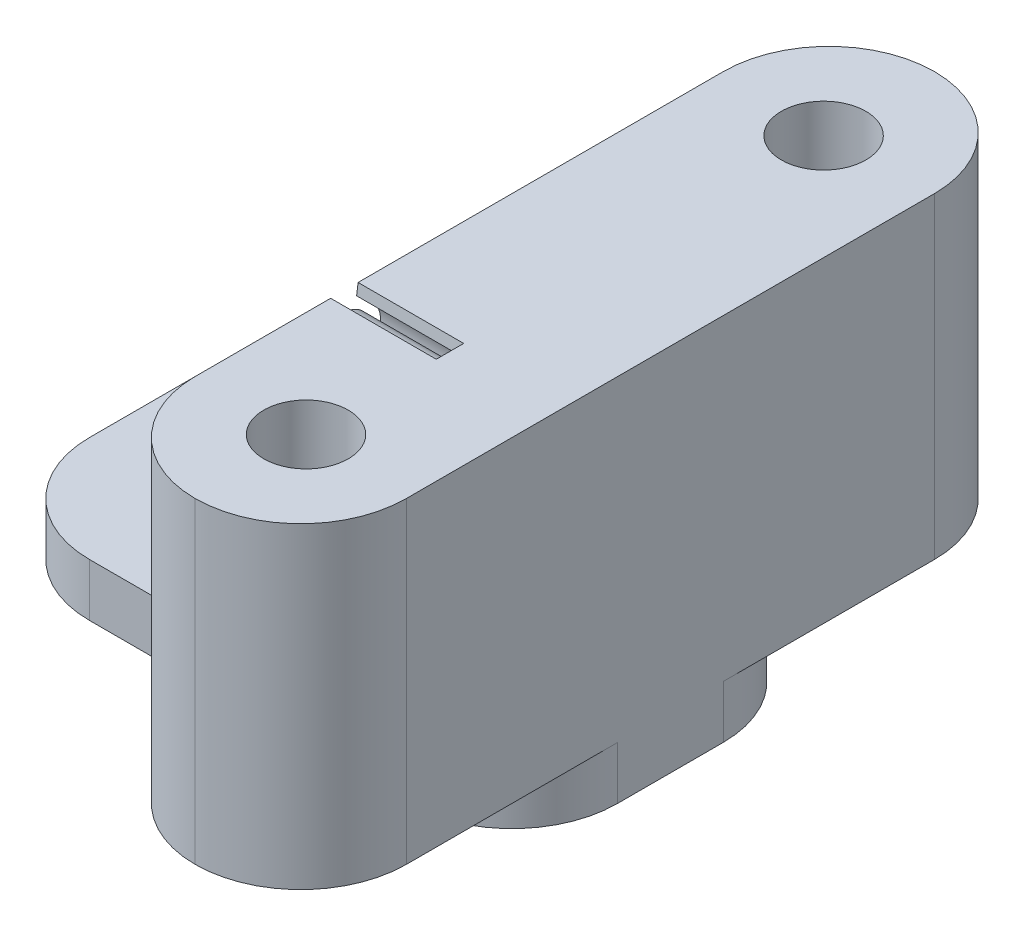
ISO-10303-21;
HEADER;
FILE_DESCRIPTION(('STEP AP214'),'2;1');
FILE_NAME('part.step','',(''),(''),'','','');
FILE_SCHEMA(('AUTOMOTIVE_DESIGN { 1 0 10303 214 1 1 1 1 }'));
ENDSEC;
DATA;
#1=APPLICATION_CONTEXT('core data for automotive mechanical design processes');
#2=APPLICATION_PROTOCOL_DEFINITION('international standard','automotive_design',2000,#1);
#3=PRODUCT_CONTEXT('',#1,'mechanical');
#4=PRODUCT('Part','Part','',(#3));
#5=PRODUCT_RELATED_PRODUCT_CATEGORY('part','',(#4));
#6=PRODUCT_DEFINITION_FORMATION('','',#4);
#7=PRODUCT_DEFINITION_CONTEXT('part definition',#1,'design');
#8=PRODUCT_DEFINITION('design','',#6,#7);
#9=PRODUCT_DEFINITION_SHAPE('','',#8);
#10=(LENGTH_UNIT() NAMED_UNIT(*) SI_UNIT(.MILLI.,.METRE.));
#11=(NAMED_UNIT(*) PLANE_ANGLE_UNIT() SI_UNIT($,.RADIAN.));
#12=(NAMED_UNIT(*) SI_UNIT($,.STERADIAN.) SOLID_ANGLE_UNIT());
#13=UNCERTAINTY_MEASURE_WITH_UNIT(LENGTH_MEASURE(1.E-05),#10,'distance_accuracy_value','');
#14=(GEOMETRIC_REPRESENTATION_CONTEXT(3) GLOBAL_UNCERTAINTY_ASSIGNED_CONTEXT((#13)) GLOBAL_UNIT_ASSIGNED_CONTEXT((#10,
#11,#12)) REPRESENTATION_CONTEXT('',''));
#15=CARTESIAN_POINT('',(0.,0.,0.));
#16=DIRECTION('',(0.,0.,1.));
#17=DIRECTION('',(1.,0.,0.));
#18=AXIS2_PLACEMENT_3D('',#15,#16,#17);
#19=CARTESIAN_POINT('',(0.,0.,0.));
#20=DIRECTION('',(0.,1.,0.));
#21=DIRECTION('',(0.,0.,1.));
#22=AXIS2_PLACEMENT_3D('',#19,#20,#21);
#23=PLANE('',#22);
#24=DIRECTION('',(-1.,0.,0.));
#25=VECTOR('',#24,1.);
#26=CARTESIAN_POINT('',(-33.5223880597015,0.,20.2388059701493));
#27=LINE('',#26,#25);
#28=CARTESIAN_POINT('',(6.47761194029853,0.,20.2388059701493));
#29=VERTEX_POINT('',#28);
#30=CARTESIAN_POINT('',(-3.52238805970146,0.,20.2388059701493));
#31=VERTEX_POINT('',#30);
#32=EDGE_CURVE('E341',#29,#31,#27,.T.);
#33=ORIENTED_EDGE('',*,*,#32,.F.);
#34=CARTESIAN_POINT('',(6.47761194029854,0.,10.2388059701493));
#35=DIRECTION('',(0.,1.,0.));
#36=DIRECTION('',(0.,0.,1.));
#37=AXIS2_PLACEMENT_3D('',#34,#35,#36);
#38=CIRCLE('',#37,10.);
#39=CARTESIAN_POINT('',(16.4776119402985,0.,10.2388059701492));
#40=VERTEX_POINT('',#39);
#41=EDGE_CURVE('E11',#29,#40,#38,.T.);
#42=ORIENTED_EDGE('',*,*,#41,.T.);
#43=DIRECTION('',(0.,0.,-1.));
#44=VECTOR('',#43,1.);
#45=CARTESIAN_POINT('',(16.4776119402985,0.,-29.7611940298508));
#46=LINE('',#45,#44);
#47=CARTESIAN_POINT('',(16.4776119402985,0.,30.2388059701493));
#48=VERTEX_POINT('',#47);
#49=EDGE_CURVE('E56',#48,#40,#46,.T.);
#50=ORIENTED_EDGE('',*,*,#49,.F.);
#51=CARTESIAN_POINT('',(6.47761194029854,0.,30.2388059701493));
#52=DIRECTION('',(0.,1.,0.));
#53=DIRECTION('',(0.,0.,1.));
#54=AXIS2_PLACEMENT_3D('',#51,#52,#53);
#55=CIRCLE('',#54,10.);
#56=CARTESIAN_POINT('',(6.47761194029854,0.,40.2388059701493));
#57=VERTEX_POINT('',#56);
#58=EDGE_CURVE('E245',#48,#57,#55,.F.);
#59=ORIENTED_EDGE('',*,*,#58,.T.);
#60=CARTESIAN_POINT('',(6.47761194029854,0.,30.2388059701493));
#61=DIRECTION('',(0.,1.,0.));
#62=DIRECTION('',(0.,0.,1.));
#63=AXIS2_PLACEMENT_3D('',#60,#61,#62);
#64=CIRCLE('',#63,10.);
#65=CARTESIAN_POINT('',(-3.52238805970146,0.,30.2388059701493));
#66=VERTEX_POINT('',#65);
#67=EDGE_CURVE('E242',#57,#66,#64,.F.);
#68=ORIENTED_EDGE('',*,*,#67,.T.);
#69=DIRECTION('',(0.,0.,1.));
#70=VECTOR('',#69,1.);
#71=CARTESIAN_POINT('',(-3.52238805970147,0.,-29.7611940298508));
#72=LINE('',#71,#70);
#73=EDGE_CURVE('E217',#31,#66,#72,.T.);
#74=ORIENTED_EDGE('',*,*,#73,.F.);
#75=EDGE_LOOP('',(#33,#42,#50,#59,#68,#74));
#76=FACE_BOUND('',#75,.T.);
#77=ADVANCED_FACE('F33',(#76),#23,.F.);
#78=DIRECTION('',(1.,0.,0.));
#79=VECTOR('',#78,1.);
#80=CARTESIAN_POINT('',(-33.5223880597015,0.,-9.76119402985075));
#81=LINE('',#80,#79);
#82=CARTESIAN_POINT('',(-3.52238805970147,0.,-9.76119402985075));
#83=VERTEX_POINT('',#82);
#84=CARTESIAN_POINT('',(6.47761194029853,0.,-9.76119402985075));
#85=VERTEX_POINT('',#84);
#86=EDGE_CURVE('E263',#83,#85,#81,.T.);
#87=ORIENTED_EDGE('',*,*,#86,.F.);
#88=CARTESIAN_POINT('',(-3.52238805970147,0.,-19.7611940298507));
#89=VERTEX_POINT('',#88);
#90=EDGE_CURVE('E233',#89,#83,#72,.T.);
#91=ORIENTED_EDGE('',*,*,#90,.F.);
#92=CARTESIAN_POINT('',(6.47761194029853,0.,-19.7611940298507));
#93=DIRECTION('',(0.,1.,0.));
#94=DIRECTION('',(0.,0.,1.));
#95=AXIS2_PLACEMENT_3D('',#92,#93,#94);
#96=CIRCLE('',#95,10.);
#97=CARTESIAN_POINT('',(6.47761194029853,0.,-29.7611940298508));
#98=VERTEX_POINT('',#97);
#99=EDGE_CURVE('E249',#89,#98,#96,.F.);
#100=ORIENTED_EDGE('',*,*,#99,.T.);
#101=CARTESIAN_POINT('',(6.47761194029853,0.,-19.7611940298507));
#102=DIRECTION('',(0.,1.,0.));
#103=DIRECTION('',(0.,0.,1.));
#104=AXIS2_PLACEMENT_3D('',#101,#102,#103);
#105=CIRCLE('',#104,10.);
#106=CARTESIAN_POINT('',(16.4776119402985,0.,-19.7611940298507));
#107=VERTEX_POINT('',#106);
#108=EDGE_CURVE('E247',#98,#107,#105,.F.);
#109=ORIENTED_EDGE('',*,*,#108,.T.);
#110=CARTESIAN_POINT('',(16.4776119402985,0.,0.238805970149251));
#111=VERTEX_POINT('',#110);
#112=EDGE_CURVE('E48',#111,#107,#46,.T.);
#113=ORIENTED_EDGE('',*,*,#112,.F.);
#114=CARTESIAN_POINT('',(6.47761194029854,0.,0.238805970149251));
#115=DIRECTION('',(0.,1.,0.));
#116=DIRECTION('',(0.,0.,1.));
#117=AXIS2_PLACEMENT_3D('',#114,#115,#116);
#118=CIRCLE('',#117,10.);
#119=EDGE_CURVE('E41',#111,#85,#118,.T.);
#120=ORIENTED_EDGE('',*,*,#119,.T.);
#121=EDGE_LOOP('',(#87,#91,#100,#109,#113,#120));
#122=FACE_BOUND('',#121,.T.);
#123=ADVANCED_FACE('F308',(#122),#23,.F.);
#124=CARTESIAN_POINT('',(-3.52238805970147,30.,-29.7611940298508));
#125=DIRECTION('',(1.,0.,0.));
#126=DIRECTION('',(0.,0.,-1.));
#127=AXIS2_PLACEMENT_3D('',#124,#125,#126);
#128=PLANE('',#127);
#129=DIRECTION('',(0.,0.,1.));
#130=VECTOR('',#129,1.);
#131=CARTESIAN_POINT('',(-3.52238805970147,30.,-29.7611940298508));
#132=LINE('',#131,#130);
#133=CARTESIAN_POINT('',(-3.52238805970147,30.,-19.7611940298507));
#134=VERTEX_POINT('',#133);
#135=CARTESIAN_POINT('',(-3.52238805970146,30.,14.812554190196));
#136=VERTEX_POINT('',#135);
#137=EDGE_CURVE('E226',#134,#136,#132,.T.);
#138=ORIENTED_EDGE('',*,*,#137,.F.);
#139=DIRECTION('',(0.,-1.,0.));
#140=VECTOR('',#139,1.);
#141=CARTESIAN_POINT('',(-3.52238805970147,30.,-19.7611940298507));
#142=LINE('',#141,#140);
#143=EDGE_CURVE('E239',#134,#89,#142,.T.);
#144=ORIENTED_EDGE('',*,*,#143,.T.);
#145=ORIENTED_EDGE('',*,*,#90,.T.);
#146=EDGE_CURVE('E236',#83,#31,#72,.T.);
#147=ORIENTED_EDGE('',*,*,#146,.T.);
#148=ORIENTED_EDGE('',*,*,#73,.T.);
#149=DIRECTION('',(0.,-1.,0.));
#150=VECTOR('',#149,1.);
#151=CARTESIAN_POINT('',(-3.52238805970146,30.,30.2388059701493));
#152=LINE('',#151,#150);
#153=CARTESIAN_POINT('',(-3.52238805970146,30.,30.2388059701493));
#154=VERTEX_POINT('',#153);
#155=EDGE_CURVE('E232',#66,#154,#152,.F.);
#156=ORIENTED_EDGE('',*,*,#155,.T.);
#157=CARTESIAN_POINT('',(-3.52238805970146,30.,17.4075983617578));
#158=VERTEX_POINT('',#157);
#159=EDGE_CURVE('E229',#158,#154,#132,.T.);
#160=ORIENTED_EDGE('',*,*,#159,.F.);
#161=DIRECTION('',(0.,-0.998274373174996,-0.0587220219514735));
#162=VECTOR('',#161,1.);
#163=CARTESIAN_POINT('',(-3.52238805970146,-0.916997145344465,15.5889514708551));
#164=LINE('',#163,#162);
#165=CARTESIAN_POINT('',(-3.52238805970146,28.9802150072761,17.3476110092446));
#166=VERTEX_POINT('',#165);
#167=EDGE_CURVE('E202',#158,#166,#164,.T.);
#168=ORIENTED_EDGE('',*,*,#167,.T.);
#169=CARTESIAN_POINT('',(-3.52238805970146,25.6865831727299,16.1635547021105));
#170=DIRECTION('',(-1.,0.,0.));
#171=DIRECTION('',(0.,0.,1.));
#172=AXIS2_PLACEMENT_3D('',#169,#170,#171);
#173=CIRCLE('',#172,3.5);
#174=CARTESIAN_POINT('',(-3.52238805970146,28.9694464253818,14.9499613334784));
#175=VERTEX_POINT('',#174);
#176=EDGE_CURVE('E199',#175,#166,#173,.T.);
#177=ORIENTED_EDGE('',*,*,#176,.F.);
#178=DIRECTION('',(0.,0.991227900682634,-0.132163720091024));
#179=VECTOR('',#178,1.);
#180=CARTESIAN_POINT('',(-3.52238805970146,2.46452674980748,18.4839506235552));
#181=LINE('',#180,#179);
#182=EDGE_CURVE('E170',#175,#136,#181,.T.);
#183=ORIENTED_EDGE('',*,*,#182,.T.);
#184=EDGE_LOOP('',(#138,#144,#145,#147,#148,#156,#160,#168,#177,#183));
#185=FACE_BOUND('',#184,.T.);
#186=ADVANCED_FACE('F369',(#185),#128,.F.);
#187=CARTESIAN_POINT('',(0.,30.,0.));
#188=DIRECTION('',(0.,1.,0.));
#189=DIRECTION('',(0.,0.,1.));
#190=AXIS2_PLACEMENT_3D('',#187,#188,#189);
#191=PLANE('',#190);
#192=CARTESIAN_POINT('',(6.47761194029853,30.,-19.2611940298507));
#193=DIRECTION('',(0.,1.,0.));
#194=DIRECTION('',(0.,0.,1.));
#195=AXIS2_PLACEMENT_3D('',#192,#193,#194);
#196=CIRCLE('',#195,4.);
#197=CARTESIAN_POINT('',(6.47761194029853,30.,-15.2611940298507));
#198=VERTEX_POINT('',#197);
#199=EDGE_CURVE('E218',#198,#198,#196,.T.);
#200=ORIENTED_EDGE('',*,*,#199,.F.);
#201=EDGE_LOOP('',(#200));
#202=FACE_BOUND('',#201,.T.);
#203=CARTESIAN_POINT('',(6.47761194029853,30.,29.7388059701493));
#204=DIRECTION('',(0.,1.,0.));
#205=DIRECTION('',(0.,0.,1.));
#206=AXIS2_PLACEMENT_3D('',#203,#204,#205);
#207=CIRCLE('',#206,4.);
#208=CARTESIAN_POINT('',(6.47761194029853,30.,33.7388059701493));
#209=VERTEX_POINT('',#208);
#210=EDGE_CURVE('E209',#209,#209,#207,.T.);
#211=ORIENTED_EDGE('',*,*,#210,.F.);
#212=EDGE_LOOP('',(#211));
#213=FACE_BOUND('',#212,.T.);
#214=CARTESIAN_POINT('',(6.47761194029853,30.,-19.7611940298507));
#215=DIRECTION('',(0.,1.,0.));
#216=DIRECTION('',(0.,0.,1.));
#217=AXIS2_PLACEMENT_3D('',#214,#215,#216);
#218=CIRCLE('',#217,10.);
#219=CARTESIAN_POINT('',(16.4776119402985,30.,-19.7611940298507));
#220=VERTEX_POINT('',#219);
#221=CARTESIAN_POINT('',(6.47761194029853,30.,-29.7611940298508));
#222=VERTEX_POINT('',#221);
#223=EDGE_CURVE('E255',#220,#222,#218,.T.);
#224=ORIENTED_EDGE('',*,*,#223,.T.);
#225=CARTESIAN_POINT('',(6.47761194029853,30.,-19.7611940298507));
#226=DIRECTION('',(0.,1.,0.));
#227=DIRECTION('',(0.,0.,1.));
#228=AXIS2_PLACEMENT_3D('',#225,#226,#227);
#229=CIRCLE('',#228,10.);
#230=EDGE_CURVE('E257',#222,#134,#229,.T.);
#231=ORIENTED_EDGE('',*,*,#230,.T.);
#232=ORIENTED_EDGE('',*,*,#137,.T.);
#233=DIRECTION('',(-1.,0.,0.));
#234=VECTOR('',#233,1.);
#235=CARTESIAN_POINT('',(6.47761194029853,30.,14.812554190196));
#236=LINE('',#235,#234);
#237=CARTESIAN_POINT('',(6.47761194029853,30.,14.812554190196));
#238=VERTEX_POINT('',#237);
#239=EDGE_CURVE('E207',#238,#136,#236,.T.);
#240=ORIENTED_EDGE('',*,*,#239,.F.);
#241=DIRECTION('',(0.,0.,-1.));
#242=VECTOR('',#241,1.);
#243=CARTESIAN_POINT('',(6.47761194029853,30.,0.));
#244=LINE('',#243,#242);
#245=CARTESIAN_POINT('',(6.47761194029853,30.,17.4075983617578));
#246=VERTEX_POINT('',#245);
#247=EDGE_CURVE('E184',#246,#238,#244,.T.);
#248=ORIENTED_EDGE('',*,*,#247,.F.);
#249=DIRECTION('',(-1.,0.,0.));
#250=VECTOR('',#249,1.);
#251=CARTESIAN_POINT('',(6.47761194029853,30.,17.4075983617578));
#252=LINE('',#251,#250);
#253=EDGE_CURVE('E210',#246,#158,#252,.T.);
#254=ORIENTED_EDGE('',*,*,#253,.T.);
#255=ORIENTED_EDGE('',*,*,#159,.T.);
#256=CARTESIAN_POINT('',(6.47761194029854,30.,30.2388059701493));
#257=DIRECTION('',(0.,1.,0.));
#258=DIRECTION('',(0.,0.,1.));
#259=AXIS2_PLACEMENT_3D('',#256,#257,#258);
#260=CIRCLE('',#259,10.);
#261=CARTESIAN_POINT('',(6.47761194029854,30.,40.2388059701493));
#262=VERTEX_POINT('',#261);
#263=EDGE_CURVE('E251',#154,#262,#260,.T.);
#264=ORIENTED_EDGE('',*,*,#263,.T.);
#265=CARTESIAN_POINT('',(6.47761194029854,30.,30.2388059701493));
#266=DIRECTION('',(0.,1.,0.));
#267=DIRECTION('',(0.,0.,1.));
#268=AXIS2_PLACEMENT_3D('',#265,#266,#267);
#269=CIRCLE('',#268,10.);
#270=CARTESIAN_POINT('',(16.4776119402985,30.,30.2388059701493));
#271=VERTEX_POINT('',#270);
#272=EDGE_CURVE('E253',#262,#271,#269,.T.);
#273=ORIENTED_EDGE('',*,*,#272,.T.);
#274=DIRECTION('',(0.,0.,-1.));
#275=VECTOR('',#274,1.);
#276=CARTESIAN_POINT('',(16.4776119402985,30.,-29.7611940298508));
#277=LINE('',#276,#275);
#278=EDGE_CURVE('E228',#271,#220,#277,.T.);
#279=ORIENTED_EDGE('',*,*,#278,.T.);
#280=EDGE_LOOP('',(#224,#231,#232,#240,#248,#254,#255,#264,#273,#279));
#281=FACE_BOUND('',#280,.T.);
#282=ADVANCED_FACE('F381',(#202,#213,#281),#191,.T.);
#283=CARTESIAN_POINT('',(16.4776119402985,30.,-29.7611940298508));
#284=DIRECTION('',(-1.,0.,0.));
#285=DIRECTION('',(0.,0.,1.));
#286=AXIS2_PLACEMENT_3D('',#283,#284,#285);
#287=PLANE('',#286);
#288=DIRECTION('',(0.,0.,1.));
#289=VECTOR('',#288,1.);
#290=CARTESIAN_POINT('',(16.4776119402985,-5.,20.2388059701493));
#291=LINE('',#290,#289);
#292=CARTESIAN_POINT('',(16.4776119402985,-5.,0.238805970149251));
#293=VERTEX_POINT('',#292);
#294=CARTESIAN_POINT('',(16.4776119402985,-5.,10.2388059701492));
#295=VERTEX_POINT('',#294);
#296=EDGE_CURVE('E327',#293,#295,#291,.T.);
#297=ORIENTED_EDGE('',*,*,#296,.F.);
#298=DIRECTION('',(0.,1.,0.));
#299=VECTOR('',#298,1.);
#300=CARTESIAN_POINT('',(16.4776119402985,30.,0.238805970149251));
#301=LINE('',#300,#299);
#302=EDGE_CURVE('E304',#293,#111,#301,.T.);
#303=ORIENTED_EDGE('',*,*,#302,.T.);
#304=ORIENTED_EDGE('',*,*,#112,.T.);
#305=DIRECTION('',(0.,-1.,0.));
#306=VECTOR('',#305,1.);
#307=CARTESIAN_POINT('',(16.4776119402985,30.,-19.7611940298507));
#308=LINE('',#307,#306);
#309=EDGE_CURVE('E261',#107,#220,#308,.F.);
#310=ORIENTED_EDGE('',*,*,#309,.T.);
#311=ORIENTED_EDGE('',*,*,#278,.F.);
#312=DIRECTION('',(0.,-1.,0.));
#313=VECTOR('',#312,1.);
#314=CARTESIAN_POINT('',(16.4776119402985,30.,30.2388059701493));
#315=LINE('',#314,#313);
#316=EDGE_CURVE('E259',#271,#48,#315,.T.);
#317=ORIENTED_EDGE('',*,*,#316,.T.);
#318=ORIENTED_EDGE('',*,*,#49,.T.);
#319=DIRECTION('',(0.,1.,0.));
#320=VECTOR('',#319,1.);
#321=CARTESIAN_POINT('',(16.4776119402985,30.,10.2388059701492));
#322=LINE('',#321,#320);
#323=EDGE_CURVE('E302',#40,#295,#322,.F.);
#324=ORIENTED_EDGE('',*,*,#323,.T.);
#325=EDGE_LOOP('',(#297,#303,#304,#310,#311,#317,#318,#324));
#326=FACE_BOUND('',#325,.T.);
#327=ADVANCED_FACE('F330',(#326),#287,.F.);
#328=CARTESIAN_POINT('',(6.47761194029853,10.,29.7388059701493));
#329=DIRECTION('',(0.,1.,0.));
#330=DIRECTION('',(0.,0.,1.));
#331=AXIS2_PLACEMENT_3D('',#328,#329,#330);
#332=CYLINDRICAL_SURFACE('',#331,4.);
#333=CARTESIAN_POINT('',(6.47761194029853,10.,29.7388059701493));
#334=DIRECTION('',(0.,1.,0.));
#335=DIRECTION('',(0.,0.,1.));
#336=AXIS2_PLACEMENT_3D('',#333,#334,#335);
#337=CIRCLE('',#336,4.);
#338=CARTESIAN_POINT('',(6.47761194029853,10.,33.7388059701493));
#339=VERTEX_POINT('',#338);
#340=EDGE_CURVE('E221',#339,#339,#337,.T.);
#341=ORIENTED_EDGE('',*,*,#340,.F.);
#342=EDGE_LOOP('',(#341));
#343=FACE_BOUND('',#342,.T.);
#344=ORIENTED_EDGE('',*,*,#210,.T.);
#345=EDGE_LOOP('',(#344));
#346=FACE_BOUND('',#345,.T.);
#347=ADVANCED_FACE('F418',(#343,#346),#332,.F.);
#348=CARTESIAN_POINT('',(6.47761194029853,10.,29.7388059701493));
#349=DIRECTION('',(0.,1.,0.));
#350=DIRECTION('',(0.,0.,1.));
#351=AXIS2_PLACEMENT_3D('',#348,#349,#350);
#352=PLANE('',#351);
#353=ORIENTED_EDGE('',*,*,#340,.T.);
#354=EDGE_LOOP('',(#353));
#355=FACE_BOUND('',#354,.T.);
#356=ADVANCED_FACE('F454',(#355),#352,.T.);
#357=CARTESIAN_POINT('',(6.47761194029853,10.,-19.2611940298507));
#358=DIRECTION('',(0.,1.,0.));
#359=DIRECTION('',(0.,0.,1.));
#360=AXIS2_PLACEMENT_3D('',#357,#358,#359);
#361=CYLINDRICAL_SURFACE('',#360,4.);
#362=CARTESIAN_POINT('',(6.47761194029853,10.,-19.2611940298507));
#363=DIRECTION('',(0.,1.,0.));
#364=DIRECTION('',(0.,0.,1.));
#365=AXIS2_PLACEMENT_3D('',#362,#363,#364);
#366=CIRCLE('',#365,4.);
#367=CARTESIAN_POINT('',(6.47761194029853,10.,-15.2611940298507));
#368=VERTEX_POINT('',#367);
#369=EDGE_CURVE('E214',#368,#368,#366,.T.);
#370=ORIENTED_EDGE('',*,*,#369,.F.);
#371=EDGE_LOOP('',(#370));
#372=FACE_BOUND('',#371,.T.);
#373=ORIENTED_EDGE('',*,*,#199,.T.);
#374=EDGE_LOOP('',(#373));
#375=FACE_BOUND('',#374,.T.);
#376=ADVANCED_FACE('F450',(#372,#375),#361,.F.);
#377=CARTESIAN_POINT('',(6.47761194029853,10.,-19.2611940298507));
#378=DIRECTION('',(0.,1.,0.));
#379=DIRECTION('',(0.,0.,1.));
#380=AXIS2_PLACEMENT_3D('',#377,#378,#379);
#381=PLANE('',#380);
#382=ORIENTED_EDGE('',*,*,#369,.T.);
#383=EDGE_LOOP('',(#382));
#384=FACE_BOUND('',#383,.T.);
#385=ADVANCED_FACE('F447',(#384),#381,.T.);
#386=CARTESIAN_POINT('',(6.47761194029853,2.46452674980748,18.4839506235552));
#387=DIRECTION('',(0.,0.132163720091024,0.991227900682634));
#388=DIRECTION('',(0.,-0.991227900682634,0.132163720091024));
#389=AXIS2_PLACEMENT_3D('',#386,#387,#388);
#390=PLANE('',#389);
#391=ORIENTED_EDGE('',*,*,#182,.F.);
#392=DIRECTION('',(-1.,0.,0.));
#393=VECTOR('',#392,1.);
#394=CARTESIAN_POINT('',(6.47761194029853,28.9694464253818,14.9499613334784));
#395=LINE('',#394,#393);
#396=CARTESIAN_POINT('',(6.47761194029853,28.9694464253818,14.9499613334784));
#397=VERTEX_POINT('',#396);
#398=EDGE_CURVE('E163',#397,#175,#395,.T.);
#399=ORIENTED_EDGE('',*,*,#398,.F.);
#400=DIRECTION('',(0.,0.991227900682634,-0.132163720091024));
#401=VECTOR('',#400,1.);
#402=CARTESIAN_POINT('',(6.47761194029853,2.46452674980748,18.4839506235552));
#403=LINE('',#402,#401);
#404=EDGE_CURVE('E167',#397,#238,#403,.T.);
#405=ORIENTED_EDGE('',*,*,#404,.T.);
#406=ORIENTED_EDGE('',*,*,#239,.T.);
#407=EDGE_LOOP('',(#391,#399,#405,#406));
#408=FACE_BOUND('',#407,.T.);
#409=ADVANCED_FACE('F165',(#408),#390,.T.);
#410=CARTESIAN_POINT('',(6.47761194029853,-0.916997145344465,15.5889514708551));
#411=DIRECTION('',(0.,0.0587220219514735,-0.998274373174996));
#412=DIRECTION('',(0.,0.998274373174996,0.0587220219514735));
#413=AXIS2_PLACEMENT_3D('',#410,#411,#412);
#414=PLANE('',#413);
#415=ORIENTED_EDGE('',*,*,#167,.F.);
#416=ORIENTED_EDGE('',*,*,#253,.F.);
#417=DIRECTION('',(0.,-0.998274373174996,-0.0587220219514735));
#418=VECTOR('',#417,1.);
#419=CARTESIAN_POINT('',(6.47761194029853,-0.916997145344465,15.5889514708551));
#420=LINE('',#419,#418);
#421=CARTESIAN_POINT('',(6.47761194029853,28.9802150072761,17.3476110092446));
#422=VERTEX_POINT('',#421);
#423=EDGE_CURVE('E190',#246,#422,#420,.T.);
#424=ORIENTED_EDGE('',*,*,#423,.T.);
#425=DIRECTION('',(-1.,0.,0.));
#426=VECTOR('',#425,1.);
#427=CARTESIAN_POINT('',(6.47761194029853,28.9802150072761,17.3476110092446));
#428=LINE('',#427,#426);
#429=EDGE_CURVE('E175',#422,#166,#428,.T.);
#430=ORIENTED_EDGE('',*,*,#429,.T.);
#431=EDGE_LOOP('',(#415,#416,#424,#430));
#432=FACE_BOUND('',#431,.T.);
#433=ADVANCED_FACE('F385',(#432),#414,.T.);
#434=CARTESIAN_POINT('',(6.47761194029853,25.6865831727299,16.1635547021105));
#435=DIRECTION('',(-1.,0.,0.));
#436=DIRECTION('',(0.,0.,1.));
#437=AXIS2_PLACEMENT_3D('',#434,#435,#436);
#438=CYLINDRICAL_SURFACE('',#437,3.5);
#439=ORIENTED_EDGE('',*,*,#176,.T.);
#440=ORIENTED_EDGE('',*,*,#429,.F.);
#441=CARTESIAN_POINT('',(6.47761194029853,25.6865831727299,16.1635547021105));
#442=DIRECTION('',(-1.,0.,0.));
#443=DIRECTION('',(0.,0.,1.));
#444=AXIS2_PLACEMENT_3D('',#441,#442,#443);
#445=CIRCLE('',#444,3.5);
#446=EDGE_CURVE('E182',#397,#422,#445,.T.);
#447=ORIENTED_EDGE('',*,*,#446,.F.);
#448=ORIENTED_EDGE('',*,*,#398,.T.);
#449=EDGE_LOOP('',(#439,#440,#447,#448));
#450=FACE_BOUND('',#449,.T.);
#451=ADVANCED_FACE('F189',(#450),#438,.F.);
#452=CARTESIAN_POINT('',(6.47761194029853,25.6865831727299,16.1635547021105));
#453=DIRECTION('',(-1.,0.,0.));
#454=DIRECTION('',(0.,0.,1.));
#455=AXIS2_PLACEMENT_3D('',#452,#453,#454);
#456=CYLINDRICAL_SURFACE('',#455,2.5);
#457=CARTESIAN_POINT('',(6.47761194029853,25.6865831727299,16.1635547021105));
#458=DIRECTION('',(-1.,0.,0.));
#459=DIRECTION('',(0.,0.,1.));
#460=AXIS2_PLACEMENT_3D('',#457,#458,#459);
#461=CIRCLE('',#460,2.5);
#462=CARTESIAN_POINT('',(6.47761194029853,25.6865831727299,18.6635547021105));
#463=VERTEX_POINT('',#462);
#464=EDGE_CURVE('E176',#463,#463,#461,.T.);
#465=ORIENTED_EDGE('',*,*,#464,.T.);
#466=EDGE_LOOP('',(#465));
#467=FACE_BOUND('',#466,.T.);
#468=CARTESIAN_POINT('',(-3.52238805970146,25.6865831727299,16.1635547021105));
#469=DIRECTION('',(-1.,0.,0.));
#470=DIRECTION('',(0.,0.,1.));
#471=AXIS2_PLACEMENT_3D('',#468,#469,#470);
#472=CIRCLE('',#471,2.5);
#473=CARTESIAN_POINT('',(-3.52238805970146,25.6865831727299,18.6635547021105));
#474=VERTEX_POINT('',#473);
#475=EDGE_CURVE('E186',#474,#474,#472,.T.);
#476=ORIENTED_EDGE('',*,*,#475,.F.);
#477=EDGE_LOOP('',(#476));
#478=FACE_BOUND('',#477,.T.);
#479=ADVANCED_FACE('F431',(#467,#478),#456,.T.);
#480=CARTESIAN_POINT('',(6.47761194029853,0.,0.));
#481=DIRECTION('',(-1.,0.,0.));
#482=DIRECTION('',(0.,0.,1.));
#483=AXIS2_PLACEMENT_3D('',#480,#481,#482);
#484=PLANE('',#483);
#485=ORIENTED_EDGE('',*,*,#404,.F.);
#486=ORIENTED_EDGE('',*,*,#446,.T.);
#487=ORIENTED_EDGE('',*,*,#423,.F.);
#488=ORIENTED_EDGE('',*,*,#247,.T.);
#489=EDGE_LOOP('',(#485,#486,#487,#488));
#490=FACE_BOUND('',#489,.T.);
#491=ORIENTED_EDGE('',*,*,#464,.F.);
#492=EDGE_LOOP('',(#491));
#493=FACE_BOUND('',#492,.T.);
#494=ADVANCED_FACE('F180',(#490,#493),#484,.T.);
#495=ORIENTED_EDGE('',*,*,#475,.T.);
#496=EDGE_LOOP('',(#495));
#497=FACE_BOUND('',#496,.T.);
#498=ADVANCED_FACE('F421',(#497),#128,.F.);
#499=CARTESIAN_POINT('',(6.47761194029853,30.,-19.7611940298507));
#500=DIRECTION('',(0.,-1.,0.));
#501=DIRECTION('',(0.,0.,-1.));
#502=AXIS2_PLACEMENT_3D('',#499,#500,#501);
#503=CYLINDRICAL_SURFACE('',#502,10.);
#504=DIRECTION('',(0.,-1.,0.));
#505=VECTOR('',#504,1.);
#506=CARTESIAN_POINT('',(6.47761194029853,30.,-29.7611940298508));
#507=LINE('',#506,#505);
#508=EDGE_CURVE('E200',#222,#98,#507,.T.);
#509=ORIENTED_EDGE('',*,*,#508,.F.);
#510=ORIENTED_EDGE('',*,*,#223,.F.);
#511=ORIENTED_EDGE('',*,*,#309,.F.);
#512=ORIENTED_EDGE('',*,*,#108,.F.);
#513=EDGE_LOOP('',(#509,#510,#511,#512));
#514=FACE_BOUND('',#513,.T.);
#515=ADVANCED_FACE('F394',(#514),#503,.T.);
#516=CARTESIAN_POINT('',(6.47761194029853,30.,-19.7611940298507));
#517=DIRECTION('',(0.,-1.,0.));
#518=DIRECTION('',(0.,0.,-1.));
#519=AXIS2_PLACEMENT_3D('',#516,#517,#518);
#520=CYLINDRICAL_SURFACE('',#519,10.);
#521=ORIENTED_EDGE('',*,*,#230,.F.);
#522=ORIENTED_EDGE('',*,*,#508,.T.);
#523=ORIENTED_EDGE('',*,*,#99,.F.);
#524=ORIENTED_EDGE('',*,*,#143,.F.);
#525=EDGE_LOOP('',(#521,#522,#523,#524));
#526=FACE_BOUND('',#525,.T.);
#527=ADVANCED_FACE('F389',(#526),#520,.T.);
#528=CARTESIAN_POINT('',(6.47761194029854,30.,30.2388059701493));
#529=DIRECTION('',(0.,-1.,0.));
#530=DIRECTION('',(0.,0.,-1.));
#531=AXIS2_PLACEMENT_3D('',#528,#529,#530);
#532=CYLINDRICAL_SURFACE('',#531,10.);
#533=DIRECTION('',(0.,-1.,0.));
#534=VECTOR('',#533,1.);
#535=CARTESIAN_POINT('',(6.47761194029854,30.,40.2388059701493));
#536=LINE('',#535,#534);
#537=EDGE_CURVE('E266',#262,#57,#536,.T.);
#538=ORIENTED_EDGE('',*,*,#537,.F.);
#539=ORIENTED_EDGE('',*,*,#263,.F.);
#540=ORIENTED_EDGE('',*,*,#155,.F.);
#541=ORIENTED_EDGE('',*,*,#67,.F.);
#542=EDGE_LOOP('',(#538,#539,#540,#541));
#543=FACE_BOUND('',#542,.T.);
#544=ADVANCED_FACE('F378',(#543),#532,.T.);
#545=CARTESIAN_POINT('',(6.47761194029854,30.,30.2388059701493));
#546=DIRECTION('',(0.,-1.,0.));
#547=DIRECTION('',(0.,0.,-1.));
#548=AXIS2_PLACEMENT_3D('',#545,#546,#547);
#549=CYLINDRICAL_SURFACE('',#548,10.);
#550=ORIENTED_EDGE('',*,*,#272,.F.);
#551=ORIENTED_EDGE('',*,*,#537,.T.);
#552=ORIENTED_EDGE('',*,*,#58,.F.);
#553=ORIENTED_EDGE('',*,*,#316,.F.);
#554=EDGE_LOOP('',(#550,#551,#552,#553));
#555=FACE_BOUND('',#554,.T.);
#556=ADVANCED_FACE('F398',(#555),#549,.T.);
#557=CARTESIAN_POINT('',(-33.5223880597015,-5.,20.2388059701493));
#558=DIRECTION('',(1.,0.,0.));
#559=DIRECTION('',(0.,0.,-1.));
#560=AXIS2_PLACEMENT_3D('',#557,#558,#559);
#561=PLANE('',#560);
#562=DIRECTION('',(0.,0.,-1.));
#563=VECTOR('',#562,1.);
#564=CARTESIAN_POINT('',(-33.5223880597015,0.,20.2388059701493));
#565=LINE('',#564,#563);
#566=CARTESIAN_POINT('',(-33.5223880597015,0.,10.2388059701493));
#567=VERTEX_POINT('',#566);
#568=CARTESIAN_POINT('',(-33.5223880597015,0.,0.238805970149251));
#569=VERTEX_POINT('',#568);
#570=EDGE_CURVE('E273',#567,#569,#565,.T.);
#571=ORIENTED_EDGE('',*,*,#570,.T.);
#572=DIRECTION('',(0.,1.,0.));
#573=VECTOR('',#572,1.);
#574=CARTESIAN_POINT('',(-33.5223880597015,-5.,0.238805970149251));
#575=LINE('',#574,#573);
#576=CARTESIAN_POINT('',(-33.5223880597015,-5.,0.238805970149251));
#577=VERTEX_POINT('',#576);
#578=EDGE_CURVE('E287',#569,#577,#575,.F.);
#579=ORIENTED_EDGE('',*,*,#578,.T.);
#580=DIRECTION('',(0.,0.,-1.));
#581=VECTOR('',#580,1.);
#582=CARTESIAN_POINT('',(-33.5223880597015,-5.,20.2388059701493));
#583=LINE('',#582,#581);
#584=CARTESIAN_POINT('',(-33.5223880597015,-5.,10.2388059701493));
#585=VERTEX_POINT('',#584);
#586=EDGE_CURVE('E335',#585,#577,#583,.T.);
#587=ORIENTED_EDGE('',*,*,#586,.F.);
#588=DIRECTION('',(0.,1.,0.));
#589=VECTOR('',#588,1.);
#590=CARTESIAN_POINT('',(-33.5223880597015,-5.,10.2388059701493));
#591=LINE('',#590,#589);
#592=EDGE_CURVE('E284',#585,#567,#591,.T.);
#593=ORIENTED_EDGE('',*,*,#592,.T.);
#594=EDGE_LOOP('',(#571,#579,#587,#593));
#595=FACE_BOUND('',#594,.T.);
#596=ADVANCED_FACE('F359',(#595),#561,.F.);
#597=CARTESIAN_POINT('',(-33.5223880597015,-5.,-9.76119402985075));
#598=DIRECTION('',(0.,0.,1.));
#599=DIRECTION('',(1.,0.,0.));
#600=AXIS2_PLACEMENT_3D('',#597,#598,#599);
#601=PLANE('',#600);
#602=DIRECTION('',(1.,0.,0.));
#603=VECTOR('',#602,1.);
#604=CARTESIAN_POINT('',(-33.5223880597015,-5.,-9.76119402985075));
#605=LINE('',#604,#603);
#606=CARTESIAN_POINT('',(-23.5223880597015,-5.,-9.76119402985075));
#607=VERTEX_POINT('',#606);
#608=CARTESIAN_POINT('',(6.47761194029853,-5.,-9.76119402985075));
#609=VERTEX_POINT('',#608);
#610=EDGE_CURVE('E329',#607,#609,#605,.T.);
#611=ORIENTED_EDGE('',*,*,#610,.F.);
#612=DIRECTION('',(0.,1.,0.));
#613=VECTOR('',#612,1.);
#614=CARTESIAN_POINT('',(-23.5223880597015,-5.,-9.76119402985075));
#615=LINE('',#614,#613);
#616=CARTESIAN_POINT('',(-23.5223880597015,0.,-9.76119402985075));
#617=VERTEX_POINT('',#616);
#618=EDGE_CURVE('E277',#607,#617,#615,.T.);
#619=ORIENTED_EDGE('',*,*,#618,.T.);
#620=EDGE_CURVE('E318',#617,#83,#81,.T.);
#621=ORIENTED_EDGE('',*,*,#620,.T.);
#622=ORIENTED_EDGE('',*,*,#86,.T.);
#623=DIRECTION('',(0.,1.,0.));
#624=VECTOR('',#623,1.);
#625=CARTESIAN_POINT('',(6.47761194029853,-5.,-9.76119402985075));
#626=LINE('',#625,#624);
#627=EDGE_CURVE('E275',#85,#609,#626,.F.);
#628=ORIENTED_EDGE('',*,*,#627,.T.);
#629=EDGE_LOOP('',(#611,#619,#621,#622,#628));
#630=FACE_BOUND('',#629,.T.);
#631=ADVANCED_FACE('F315',(#630),#601,.F.);
#632=CARTESIAN_POINT('',(-33.5223880597015,-5.,20.2388059701493));
#633=DIRECTION('',(0.,0.,-1.));
#634=DIRECTION('',(-1.,0.,0.));
#635=AXIS2_PLACEMENT_3D('',#632,#633,#634);
#636=PLANE('',#635);
#637=CARTESIAN_POINT('',(-23.5223880597015,0.,20.2388059701493));
#638=VERTEX_POINT('',#637);
#639=EDGE_CURVE('E340',#31,#638,#27,.T.);
#640=ORIENTED_EDGE('',*,*,#639,.T.);
#641=DIRECTION('',(0.,1.,0.));
#642=VECTOR('',#641,1.);
#643=CARTESIAN_POINT('',(-23.5223880597015,-5.,20.2388059701493));
#644=LINE('',#643,#642);
#645=CARTESIAN_POINT('',(-23.5223880597015,-5.,20.2388059701493));
#646=VERTEX_POINT('',#645);
#647=EDGE_CURVE('E300',#638,#646,#644,.F.);
#648=ORIENTED_EDGE('',*,*,#647,.T.);
#649=DIRECTION('',(-1.,0.,0.));
#650=VECTOR('',#649,1.);
#651=CARTESIAN_POINT('',(-33.5223880597015,-5.,20.2388059701493));
#652=LINE('',#651,#650);
#653=CARTESIAN_POINT('',(6.47761194029853,-5.,20.2388059701493));
#654=VERTEX_POINT('',#653);
#655=EDGE_CURVE('E269',#654,#646,#652,.T.);
#656=ORIENTED_EDGE('',*,*,#655,.F.);
#657=DIRECTION('',(0.,1.,0.));
#658=VECTOR('',#657,1.);
#659=CARTESIAN_POINT('',(6.47761194029854,-5.,20.2388059701493));
#660=LINE('',#659,#658);
#661=EDGE_CURVE('E297',#654,#29,#660,.T.);
#662=ORIENTED_EDGE('',*,*,#661,.T.);
#663=ORIENTED_EDGE('',*,*,#32,.T.);
#664=EDGE_LOOP('',(#640,#648,#656,#662,#663));
#665=FACE_BOUND('',#664,.T.);
#666=ADVANCED_FACE('F348',(#665),#636,.F.);
#667=CARTESIAN_POINT('',(0.,-5.,0.));
#668=DIRECTION('',(0.,-1.,0.));
#669=DIRECTION('',(0.,0.,-1.));
#670=AXIS2_PLACEMENT_3D('',#667,#668,#669);
#671=PLANE('',#670);
#672=CARTESIAN_POINT('',(-13.5223880597015,-5.,5.23880597014925));
#673=DIRECTION('',(0.,-1.,0.));
#674=DIRECTION('',(0.,0.,-1.));
#675=AXIS2_PLACEMENT_3D('',#672,#673,#674);
#676=CIRCLE('',#675,2.5);
#677=CARTESIAN_POINT('',(-13.5223880597015,-5.,2.73880597014925));
#678=VERTEX_POINT('',#677);
#679=EDGE_CURVE('E274',#678,#678,#676,.T.);
#680=ORIENTED_EDGE('',*,*,#679,.F.);
#681=EDGE_LOOP('',(#680));
#682=FACE_BOUND('',#681,.T.);
#683=ORIENTED_EDGE('',*,*,#586,.T.);
#684=CARTESIAN_POINT('',(-23.5223880597015,-5.,0.238805970149251));
#685=DIRECTION('',(0.,-1.,0.));
#686=DIRECTION('',(0.,0.,-1.));
#687=AXIS2_PLACEMENT_3D('',#684,#685,#686);
#688=CIRCLE('',#687,10.);
#689=EDGE_CURVE('E295',#577,#607,#688,.T.);
#690=ORIENTED_EDGE('',*,*,#689,.T.);
#691=ORIENTED_EDGE('',*,*,#610,.T.);
#692=CARTESIAN_POINT('',(6.47761194029854,-5.,0.238805970149251));
#693=DIRECTION('',(0.,-1.,0.));
#694=DIRECTION('',(0.,0.,-1.));
#695=AXIS2_PLACEMENT_3D('',#692,#693,#694);
#696=CIRCLE('',#695,10.);
#697=EDGE_CURVE('E291',#609,#293,#696,.T.);
#698=ORIENTED_EDGE('',*,*,#697,.T.);
#699=ORIENTED_EDGE('',*,*,#296,.T.);
#700=CARTESIAN_POINT('',(6.47761194029854,-5.,10.2388059701493));
#701=DIRECTION('',(0.,-1.,0.));
#702=DIRECTION('',(0.,0.,-1.));
#703=AXIS2_PLACEMENT_3D('',#700,#701,#702);
#704=CIRCLE('',#703,10.);
#705=EDGE_CURVE('E289',#295,#654,#704,.T.);
#706=ORIENTED_EDGE('',*,*,#705,.T.);
#707=ORIENTED_EDGE('',*,*,#655,.T.);
#708=CARTESIAN_POINT('',(-23.5223880597015,-5.,10.2388059701493));
#709=DIRECTION('',(0.,-1.,0.));
#710=DIRECTION('',(0.,0.,-1.));
#711=AXIS2_PLACEMENT_3D('',#708,#709,#710);
#712=CIRCLE('',#711,10.);
#713=EDGE_CURVE('E293',#646,#585,#712,.T.);
#714=ORIENTED_EDGE('',*,*,#713,.T.);
#715=EDGE_LOOP('',(#683,#690,#691,#698,#699,#706,#707,#714));
#716=FACE_BOUND('',#715,.T.);
#717=ADVANCED_FACE('F326',(#682,#716),#671,.T.);
#718=CARTESIAN_POINT('',(0.,0.,0.));
#719=DIRECTION('',(0.,-1.,0.));
#720=DIRECTION('',(0.,0.,-1.));
#721=AXIS2_PLACEMENT_3D('',#718,#719,#720);
#722=PLANE('',#721);
#723=CARTESIAN_POINT('',(-13.5223880597015,0.,5.23880597014925));
#724=DIRECTION('',(0.,-1.,0.));
#725=DIRECTION('',(0.,0.,-1.));
#726=AXIS2_PLACEMENT_3D('',#723,#724,#725);
#727=CIRCLE('',#726,2.5);
#728=CARTESIAN_POINT('',(-13.5223880597015,0.,2.73880597014925));
#729=VERTEX_POINT('',#728);
#730=EDGE_CURVE('E270',#729,#729,#727,.T.);
#731=ORIENTED_EDGE('',*,*,#730,.T.);
#732=EDGE_LOOP('',(#731));
#733=FACE_BOUND('',#732,.T.);
#734=ORIENTED_EDGE('',*,*,#620,.F.);
#735=CARTESIAN_POINT('',(-23.5223880597015,0.,0.238805970149251));
#736=DIRECTION('',(0.,-1.,0.));
#737=DIRECTION('',(0.,0.,-1.));
#738=AXIS2_PLACEMENT_3D('',#735,#736,#737);
#739=CIRCLE('',#738,10.);
#740=EDGE_CURVE('E282',#617,#569,#739,.F.);
#741=ORIENTED_EDGE('',*,*,#740,.T.);
#742=ORIENTED_EDGE('',*,*,#570,.F.);
#743=CARTESIAN_POINT('',(-23.5223880597015,0.,10.2388059701493));
#744=DIRECTION('',(0.,-1.,0.));
#745=DIRECTION('',(0.,0.,-1.));
#746=AXIS2_PLACEMENT_3D('',#743,#744,#745);
#747=CIRCLE('',#746,10.);
#748=EDGE_CURVE('E280',#567,#638,#747,.F.);
#749=ORIENTED_EDGE('',*,*,#748,.T.);
#750=ORIENTED_EDGE('',*,*,#639,.F.);
#751=ORIENTED_EDGE('',*,*,#146,.F.);
#752=EDGE_LOOP('',(#734,#741,#742,#749,#750,#751));
#753=FACE_BOUND('',#752,.T.);
#754=ADVANCED_FACE('F365',(#733,#753),#722,.F.);
#755=CARTESIAN_POINT('',(-13.5223880597015,5.,5.23880597014925));
#756=DIRECTION('',(0.,-1.,0.));
#757=DIRECTION('',(0.,0.,-1.));
#758=AXIS2_PLACEMENT_3D('',#755,#756,#757);
#759=CYLINDRICAL_SURFACE('',#758,2.5);
#760=ORIENTED_EDGE('',*,*,#679,.T.);
#761=EDGE_LOOP('',(#760));
#762=FACE_BOUND('',#761,.T.);
#763=ORIENTED_EDGE('',*,*,#730,.F.);
#764=EDGE_LOOP('',(#763));
#765=FACE_BOUND('',#764,.T.);
#766=ADVANCED_FACE('F523',(#762,#765),#759,.F.);
#767=CARTESIAN_POINT('',(-23.5223880597015,-5.,0.238805970149251));
#768=DIRECTION('',(0.,1.,0.));
#769=DIRECTION('',(0.,0.,1.));
#770=AXIS2_PLACEMENT_3D('',#767,#768,#769);
#771=CYLINDRICAL_SURFACE('',#770,10.);
#772=ORIENTED_EDGE('',*,*,#689,.F.);
#773=ORIENTED_EDGE('',*,*,#578,.F.);
#774=ORIENTED_EDGE('',*,*,#740,.F.);
#775=ORIENTED_EDGE('',*,*,#618,.F.);
#776=EDGE_LOOP('',(#772,#773,#774,#775));
#777=FACE_BOUND('',#776,.T.);
#778=ADVANCED_FACE('F363',(#777),#771,.T.);
#779=CARTESIAN_POINT('',(-23.5223880597015,-5.,10.2388059701493));
#780=DIRECTION('',(0.,1.,0.));
#781=DIRECTION('',(0.,0.,1.));
#782=AXIS2_PLACEMENT_3D('',#779,#780,#781);
#783=CYLINDRICAL_SURFACE('',#782,10.);
#784=ORIENTED_EDGE('',*,*,#713,.F.);
#785=ORIENTED_EDGE('',*,*,#647,.F.);
#786=ORIENTED_EDGE('',*,*,#748,.F.);
#787=ORIENTED_EDGE('',*,*,#592,.F.);
#788=EDGE_LOOP('',(#784,#785,#786,#787));
#789=FACE_BOUND('',#788,.T.);
#790=ADVANCED_FACE('F354',(#789),#783,.T.);
#791=CARTESIAN_POINT('',(6.47761194029854,30.,0.238805970149251));
#792=DIRECTION('',(0.,1.,0.));
#793=DIRECTION('',(0.,0.,1.));
#794=AXIS2_PLACEMENT_3D('',#791,#792,#793);
#795=CYLINDRICAL_SURFACE('',#794,10.);
#796=ORIENTED_EDGE('',*,*,#697,.F.);
#797=ORIENTED_EDGE('',*,*,#627,.F.);
#798=ORIENTED_EDGE('',*,*,#119,.F.);
#799=ORIENTED_EDGE('',*,*,#302,.F.);
#800=EDGE_LOOP('',(#796,#797,#798,#799));
#801=FACE_BOUND('',#800,.T.);
#802=ADVANCED_FACE('F321',(#801),#795,.T.);
#803=CARTESIAN_POINT('',(6.47761194029854,-5.,10.2388059701493));
#804=DIRECTION('',(0.,1.,0.));
#805=DIRECTION('',(0.,0.,1.));
#806=AXIS2_PLACEMENT_3D('',#803,#804,#805);
#807=CYLINDRICAL_SURFACE('',#806,10.);
#808=ORIENTED_EDGE('',*,*,#705,.F.);
#809=ORIENTED_EDGE('',*,*,#323,.F.);
#810=ORIENTED_EDGE('',*,*,#41,.F.);
#811=ORIENTED_EDGE('',*,*,#661,.F.);
#812=EDGE_LOOP('',(#808,#809,#810,#811));
#813=FACE_BOUND('',#812,.T.);
#814=ADVANCED_FACE('F35',(#813),#807,.T.);
#815=CLOSED_SHELL('',(#77,#123,#186,#282,#327,#347,#356,#376,#385,#409,#433,#451,#479,#494,#498,
#515,#527,#544,#556,#596,#631,#666,#717,#754,#766,#778,#790,#802,#814));
#816=MANIFOLD_SOLID_BREP('B2',#815);
#817=ADVANCED_BREP_SHAPE_REPRESENTATION('',(#18,#816),#14);
#818=SHAPE_DEFINITION_REPRESENTATION(#9,#817);
ENDSEC;
END-ISO-10303-21;
